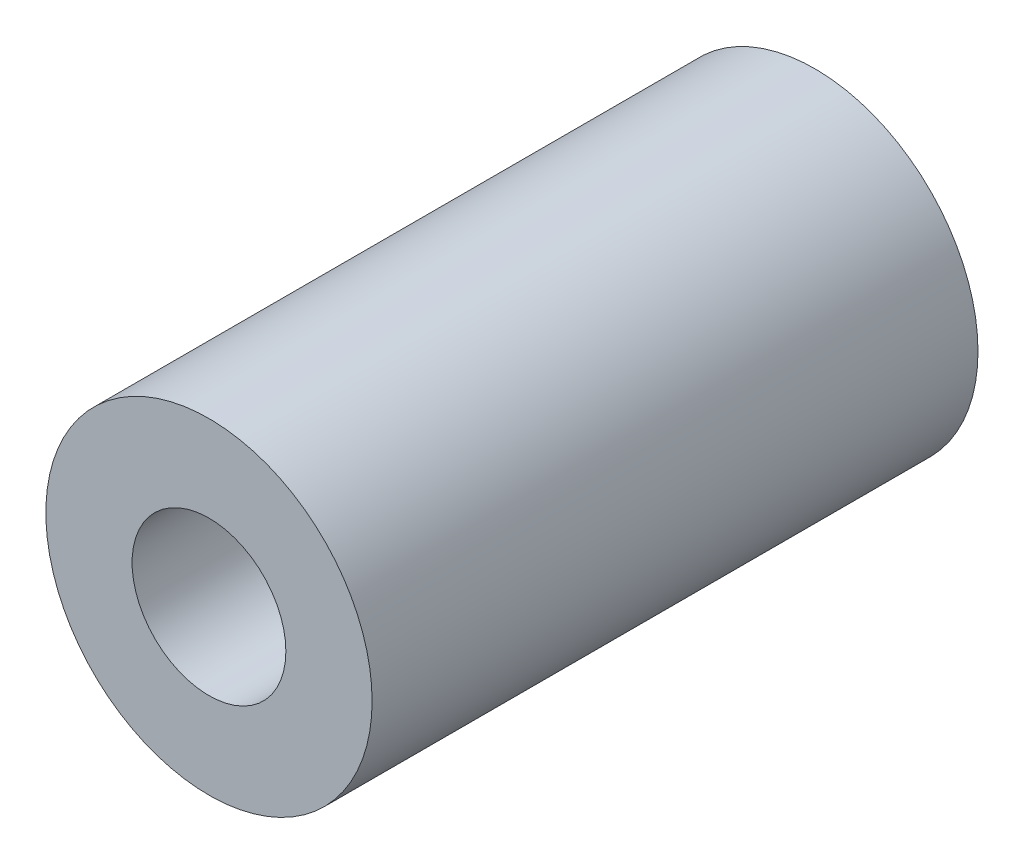
ISO-10303-21;
HEADER;
FILE_DESCRIPTION(('STEP AP214'),'2;1');
FILE_NAME('part.step','',(''),(''),'','','');
FILE_SCHEMA(('AUTOMOTIVE_DESIGN { 1 0 10303 214 1 1 1 1 }'));
ENDSEC;
DATA;
#1=APPLICATION_CONTEXT('core data for automotive mechanical design processes');
#2=APPLICATION_PROTOCOL_DEFINITION('international standard','automotive_design',2000,#1);
#3=PRODUCT_CONTEXT('',#1,'mechanical');
#4=PRODUCT('Part','Part','',(#3));
#5=PRODUCT_RELATED_PRODUCT_CATEGORY('part','',(#4));
#6=PRODUCT_DEFINITION_FORMATION('','',#4);
#7=PRODUCT_DEFINITION_CONTEXT('part definition',#1,'design');
#8=PRODUCT_DEFINITION('design','',#6,#7);
#9=PRODUCT_DEFINITION_SHAPE('','',#8);
#10=(LENGTH_UNIT() NAMED_UNIT(*) SI_UNIT(.MILLI.,.METRE.));
#11=(NAMED_UNIT(*) PLANE_ANGLE_UNIT() SI_UNIT($,.RADIAN.));
#12=(NAMED_UNIT(*) SI_UNIT($,.STERADIAN.) SOLID_ANGLE_UNIT());
#13=UNCERTAINTY_MEASURE_WITH_UNIT(LENGTH_MEASURE(1.E-05),#10,'distance_accuracy_value','');
#14=(GEOMETRIC_REPRESENTATION_CONTEXT(3) GLOBAL_UNCERTAINTY_ASSIGNED_CONTEXT((#13)) GLOBAL_UNIT_ASSIGNED_CONTEXT((#10,
#11,#12)) REPRESENTATION_CONTEXT('',''));
#15=CARTESIAN_POINT('',(0.,0.,0.));
#16=DIRECTION('',(0.,0.,1.));
#17=DIRECTION('',(1.,0.,0.));
#18=AXIS2_PLACEMENT_3D('',#15,#16,#17);
#19=CARTESIAN_POINT('',(-17.38805970149,45.970149253731,-19.5));
#20=DIRECTION('',(0.,0.,1.));
#21=DIRECTION('',(1.,0.,0.));
#22=AXIS2_PLACEMENT_3D('',#19,#20,#21);
#23=CYLINDRICAL_SURFACE('',#22,1.65);
#24=DIRECTION('',(0.,0.,1.));
#25=VECTOR('',#24,1.);
#26=CARTESIAN_POINT('',(-15.73805970149,45.970149253731,-19.5));
#27=LINE('',#26,#25);
#28=CARTESIAN_POINT('',(-15.73805970149,45.970149253731,0.));
#29=VERTEX_POINT('',#28);
#30=CARTESIAN_POINT('',(-15.73805970149,45.970149253731,13.));
#31=VERTEX_POINT('',#30);
#32=EDGE_CURVE('E10',#29,#31,#27,.T.);
#33=ORIENTED_EDGE('',*,*,#32,.F.);
#34=CARTESIAN_POINT('',(-17.38805970149,45.970149253731,0.));
#35=DIRECTION('',(0.,0.,1.));
#36=DIRECTION('',(1.,0.,0.));
#37=AXIS2_PLACEMENT_3D('',#34,#35,#36);
#38=CIRCLE('',#37,1.65);
#39=EDGE_CURVE('E27',#29,#29,#38,.T.);
#40=ORIENTED_EDGE('',*,*,#39,.F.);
#41=ORIENTED_EDGE('',*,*,#32,.T.);
#42=CARTESIAN_POINT('',(-17.38805970149,45.970149253731,13.));
#43=DIRECTION('',(0.,0.,1.));
#44=DIRECTION('',(1.,0.,0.));
#45=AXIS2_PLACEMENT_3D('',#42,#43,#44);
#46=CIRCLE('',#45,1.65);
#47=EDGE_CURVE('E58',#31,#31,#46,.T.);
#48=ORIENTED_EDGE('',*,*,#47,.T.);
#49=EDGE_LOOP('',(#33,#40,#41,#48));
#50=FACE_BOUND('',#49,.T.);
#51=ADVANCED_FACE('F16',(#50),#23,.F.);
#52=CARTESIAN_POINT('',(-17.38805970149,45.970149253731,0.));
#53=DIRECTION('',(0.,0.,1.));
#54=DIRECTION('',(1.,0.,0.));
#55=AXIS2_PLACEMENT_3D('',#52,#53,#54);
#56=PLANE('',#55);
#57=ORIENTED_EDGE('',*,*,#39,.T.);
#58=EDGE_LOOP('',(#57));
#59=FACE_BOUND('',#58,.T.);
#60=CARTESIAN_POINT('',(-17.38805970149,45.970149253731,0.));
#61=DIRECTION('',(0.,0.,1.));
#62=DIRECTION('',(1.,0.,0.));
#63=AXIS2_PLACEMENT_3D('',#60,#61,#62);
#64=CIRCLE('',#63,3.5);
#65=CARTESIAN_POINT('',(-13.88805970149,45.970149253731,0.));
#66=VERTEX_POINT('',#65);
#67=EDGE_CURVE('E55',#66,#66,#64,.T.);
#68=ORIENTED_EDGE('',*,*,#67,.F.);
#69=EDGE_LOOP('',(#68));
#70=FACE_BOUND('',#69,.T.);
#71=ADVANCED_FACE('F71',(#59,#70),#56,.F.);
#72=CARTESIAN_POINT('',(-17.38805970149,45.970149253731,13.));
#73=DIRECTION('',(0.,0.,1.));
#74=DIRECTION('',(1.,0.,0.));
#75=AXIS2_PLACEMENT_3D('',#72,#73,#74);
#76=PLANE('',#75);
#77=ORIENTED_EDGE('',*,*,#47,.F.);
#78=EDGE_LOOP('',(#77));
#79=FACE_BOUND('',#78,.T.);
#80=CARTESIAN_POINT('',(-17.38805970149,45.970149253731,13.));
#81=DIRECTION('',(0.,0.,1.));
#82=DIRECTION('',(1.,0.,0.));
#83=AXIS2_PLACEMENT_3D('',#80,#81,#82);
#84=CIRCLE('',#83,3.5);
#85=CARTESIAN_POINT('',(-13.88805970149,45.970149253731,13.));
#86=VERTEX_POINT('',#85);
#87=EDGE_CURVE('E64',#86,#86,#84,.T.);
#88=ORIENTED_EDGE('',*,*,#87,.T.);
#89=EDGE_LOOP('',(#88));
#90=FACE_BOUND('',#89,.T.);
#91=ADVANCED_FACE('F69',(#79,#90),#76,.T.);
#92=CARTESIAN_POINT('',(-17.38805970149,45.970149253731,0.));
#93=DIRECTION('',(0.,0.,1.));
#94=DIRECTION('',(1.,0.,0.));
#95=AXIS2_PLACEMENT_3D('',#92,#93,#94);
#96=CYLINDRICAL_SURFACE('',#95,3.5);
#97=ORIENTED_EDGE('',*,*,#87,.F.);
#98=DIRECTION('',(0.,0.,1.));
#99=VECTOR('',#98,1.);
#100=CARTESIAN_POINT('',(-13.88805970149,45.970149253731,0.));
#101=LINE('',#100,#99);
#102=EDGE_CURVE('E20',#66,#86,#101,.T.);
#103=ORIENTED_EDGE('',*,*,#102,.F.);
#104=ORIENTED_EDGE('',*,*,#67,.T.);
#105=ORIENTED_EDGE('',*,*,#102,.T.);
#106=EDGE_LOOP('',(#97,#103,#104,#105));
#107=FACE_BOUND('',#106,.T.);
#108=ADVANCED_FACE('F18',(#107),#96,.T.);
#109=CLOSED_SHELL('',(#51,#71,#91,#108));
#110=MANIFOLD_SOLID_BREP('B1',#109);
#111=ADVANCED_BREP_SHAPE_REPRESENTATION('',(#18,#110),#14);
#112=SHAPE_DEFINITION_REPRESENTATION(#9,#111);
ENDSEC;
END-ISO-10303-21;
